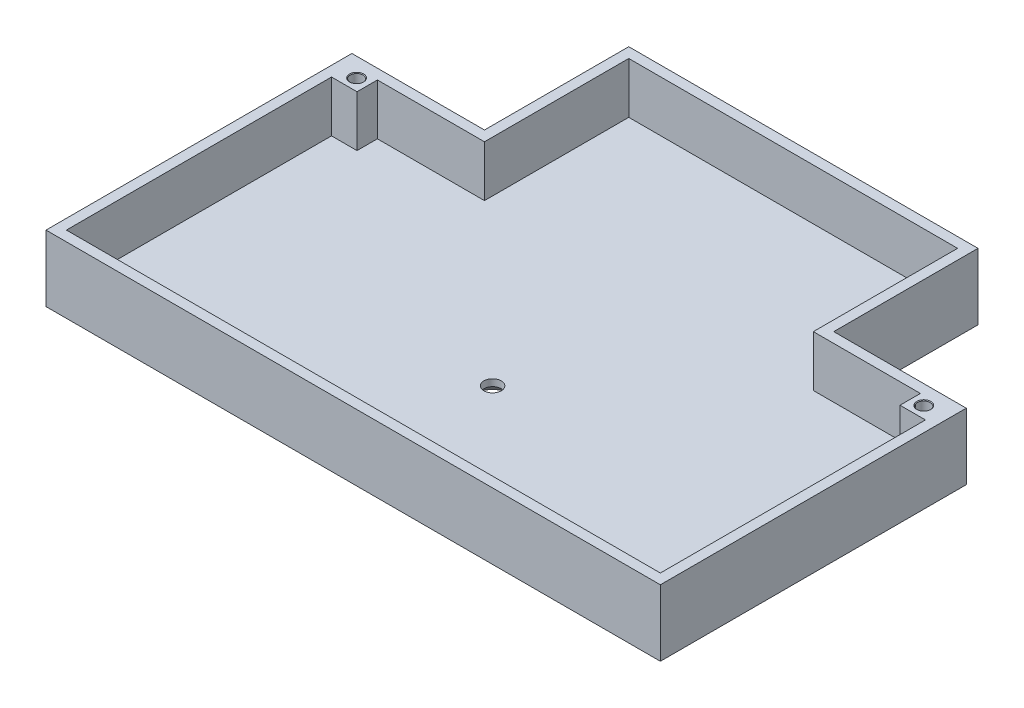
ISO-10303-21;
HEADER;
FILE_DESCRIPTION(('STEP AP214'),'2;1');
FILE_NAME('part.step','',(''),(''),'','','');
FILE_SCHEMA(('AUTOMOTIVE_DESIGN { 1 0 10303 214 1 1 1 1 }'));
ENDSEC;
DATA;
#1=APPLICATION_CONTEXT('core data for automotive mechanical design processes');
#2=APPLICATION_PROTOCOL_DEFINITION('international standard','automotive_design',2000,#1);
#3=PRODUCT_CONTEXT('',#1,'mechanical');
#4=PRODUCT('Part','Part','',(#3));
#5=PRODUCT_RELATED_PRODUCT_CATEGORY('part','',(#4));
#6=PRODUCT_DEFINITION_FORMATION('','',#4);
#7=PRODUCT_DEFINITION_CONTEXT('part definition',#1,'design');
#8=PRODUCT_DEFINITION('design','',#6,#7);
#9=PRODUCT_DEFINITION_SHAPE('','',#8);
#10=(LENGTH_UNIT() NAMED_UNIT(*) SI_UNIT(.MILLI.,.METRE.));
#11=(NAMED_UNIT(*) PLANE_ANGLE_UNIT() SI_UNIT($,.RADIAN.));
#12=(NAMED_UNIT(*) SI_UNIT($,.STERADIAN.) SOLID_ANGLE_UNIT());
#13=UNCERTAINTY_MEASURE_WITH_UNIT(LENGTH_MEASURE(1.E-05),#10,'distance_accuracy_value','');
#14=(GEOMETRIC_REPRESENTATION_CONTEXT(3) GLOBAL_UNCERTAINTY_ASSIGNED_CONTEXT((#13)) GLOBAL_UNIT_ASSIGNED_CONTEXT((#10,
#11,#12)) REPRESENTATION_CONTEXT('',''));
#15=CARTESIAN_POINT('',(0.,0.,0.));
#16=DIRECTION('',(0.,0.,1.));
#17=DIRECTION('',(1.,0.,0.));
#18=AXIS2_PLACEMENT_3D('',#15,#16,#17);
#19=CARTESIAN_POINT('',(-32.25,13.,-28.));
#20=DIRECTION('',(0.,0.,1.));
#21=DIRECTION('',(1.,0.,0.));
#22=AXIS2_PLACEMENT_3D('',#19,#20,#21);
#23=PLANE('',#22);
#24=DIRECTION('',(-1.,0.,0.));
#25=VECTOR('',#24,1.);
#26=CARTESIAN_POINT('',(-32.25,13.,-28.));
#27=LINE('',#26,#25);
#28=CARTESIAN_POINT('',(-32.25,13.,-28.));
#29=VERTEX_POINT('',#28);
#30=CARTESIAN_POINT('',(-53.25,13.,-28.));
#31=VERTEX_POINT('',#30);
#32=EDGE_CURVE('E247',#29,#31,#27,.T.);
#33=ORIENTED_EDGE('',*,*,#32,.T.);
#34=DIRECTION('',(0.,-1.,0.));
#35=VECTOR('',#34,1.);
#36=CARTESIAN_POINT('',(-53.25,13.,-28.));
#37=LINE('',#36,#35);
#38=CARTESIAN_POINT('',(-53.25,3.,-28.));
#39=VERTEX_POINT('',#38);
#40=EDGE_CURVE('E226',#31,#39,#37,.T.);
#41=ORIENTED_EDGE('',*,*,#40,.T.);
#42=DIRECTION('',(-1.,0.,0.));
#43=VECTOR('',#42,1.);
#44=CARTESIAN_POINT('',(-32.25,3.,-28.));
#45=LINE('',#44,#43);
#46=CARTESIAN_POINT('',(-32.25,3.,-28.));
#47=VERTEX_POINT('',#46);
#48=EDGE_CURVE('E266',#47,#39,#45,.T.);
#49=ORIENTED_EDGE('',*,*,#48,.F.);
#50=DIRECTION('',(0.,-1.,0.));
#51=VECTOR('',#50,1.);
#52=CARTESIAN_POINT('',(-32.25,13.,-28.));
#53=LINE('',#52,#51);
#54=EDGE_CURVE('E293',#29,#47,#53,.T.);
#55=ORIENTED_EDGE('',*,*,#54,.F.);
#56=EDGE_LOOP('',(#33,#41,#49,#55));
#57=FACE_BOUND('',#56,.T.);
#58=ADVANCED_FACE('F33',(#57),#23,.T.);
#59=CARTESIAN_POINT('',(-58.25,13.,-28.));
#60=DIRECTION('',(1.,0.,0.));
#61=DIRECTION('',(0.,0.,-1.));
#62=AXIS2_PLACEMENT_3D('',#59,#60,#61);
#63=PLANE('',#62);
#64=DIRECTION('',(0.,0.,1.));
#65=VECTOR('',#64,1.);
#66=CARTESIAN_POINT('',(-58.25,3.,-28.));
#67=LINE('',#66,#65);
#68=CARTESIAN_POINT('',(-58.25,3.,-24.));
#69=VERTEX_POINT('',#68);
#70=CARTESIAN_POINT('',(-58.25,3.,28.));
#71=VERTEX_POINT('',#70);
#72=EDGE_CURVE('E268',#69,#71,#67,.T.);
#73=ORIENTED_EDGE('',*,*,#72,.F.);
#74=DIRECTION('',(0.,-1.,0.));
#75=VECTOR('',#74,1.);
#76=CARTESIAN_POINT('',(-58.25,13.,-24.));
#77=LINE('',#76,#75);
#78=CARTESIAN_POINT('',(-58.25,13.,-24.));
#79=VERTEX_POINT('',#78);
#80=EDGE_CURVE('E236',#79,#69,#77,.T.);
#81=ORIENTED_EDGE('',*,*,#80,.F.);
#82=DIRECTION('',(0.,0.,1.));
#83=VECTOR('',#82,1.);
#84=CARTESIAN_POINT('',(-58.25,13.,-28.));
#85=LINE('',#84,#83);
#86=CARTESIAN_POINT('',(-58.25,13.,28.));
#87=VERTEX_POINT('',#86);
#88=EDGE_CURVE('E250',#79,#87,#85,.T.);
#89=ORIENTED_EDGE('',*,*,#88,.T.);
#90=DIRECTION('',(0.,-1.,0.));
#91=VECTOR('',#90,1.);
#92=CARTESIAN_POINT('',(-58.25,13.,28.));
#93=LINE('',#92,#91);
#94=EDGE_CURVE('E290',#87,#71,#93,.T.);
#95=ORIENTED_EDGE('',*,*,#94,.T.);
#96=EDGE_LOOP('',(#73,#81,#89,#95));
#97=FACE_BOUND('',#96,.T.);
#98=ADVANCED_FACE('F401',(#97),#63,.T.);
#99=CARTESIAN_POINT('',(0.,3.,0.));
#100=DIRECTION('',(0.,-1.,0.));
#101=DIRECTION('',(0.,0.,-1.));
#102=AXIS2_PLACEMENT_3D('',#99,#100,#101);
#103=PLANE('',#102);
#104=CARTESIAN_POINT('',(0.,3.,2.66000000000001));
#105=DIRECTION('',(0.,-1.,0.));
#106=DIRECTION('',(0.,0.,-1.));
#107=AXIS2_PLACEMENT_3D('',#104,#105,#106);
#108=CIRCLE('',#107,1.7);
#109=CARTESIAN_POINT('',(0.,3.,0.960000000000006));
#110=VERTEX_POINT('',#109);
#111=EDGE_CURVE('E37',#110,#110,#108,.T.);
#112=ORIENTED_EDGE('',*,*,#111,.T.);
#113=EDGE_LOOP('',(#112));
#114=FACE_BOUND('',#113,.T.);
#115=DIRECTION('',(-1.,0.,0.));
#116=VECTOR('',#115,1.);
#117=CARTESIAN_POINT('',(58.25,3.,-24.));
#118=LINE('',#117,#116);
#119=CARTESIAN_POINT('',(58.25,3.,-24.));
#120=VERTEX_POINT('',#119);
#121=CARTESIAN_POINT('',(53.25,3.,-24.));
#122=VERTEX_POINT('',#121);
#123=EDGE_CURVE('E49',#120,#122,#118,.T.);
#124=ORIENTED_EDGE('',*,*,#123,.T.);
#125=DIRECTION('',(0.,0.,-1.));
#126=VECTOR('',#125,1.);
#127=CARTESIAN_POINT('',(53.25,3.,-28.));
#128=LINE('',#127,#126);
#129=CARTESIAN_POINT('',(53.25,3.,-28.));
#130=VERTEX_POINT('',#129);
#131=EDGE_CURVE('E187',#122,#130,#128,.T.);
#132=ORIENTED_EDGE('',*,*,#131,.T.);
#133=DIRECTION('',(-1.,0.,0.));
#134=VECTOR('',#133,1.);
#135=CARTESIAN_POINT('',(58.25,3.,-28.));
#136=LINE('',#135,#134);
#137=CARTESIAN_POINT('',(32.25,3.,-28.));
#138=VERTEX_POINT('',#137);
#139=EDGE_CURVE('E275',#130,#138,#136,.T.);
#140=ORIENTED_EDGE('',*,*,#139,.T.);
#141=DIRECTION('',(0.,0.,-1.));
#142=VECTOR('',#141,1.);
#143=CARTESIAN_POINT('',(32.25,3.,-28.));
#144=LINE('',#143,#142);
#145=CARTESIAN_POINT('',(32.25,3.,-56.3));
#146=VERTEX_POINT('',#145);
#147=EDGE_CURVE('E277',#138,#146,#144,.T.);
#148=ORIENTED_EDGE('',*,*,#147,.T.);
#149=DIRECTION('',(-1.,0.,0.));
#150=VECTOR('',#149,1.);
#151=CARTESIAN_POINT('',(32.25,3.,-56.3));
#152=LINE('',#151,#150);
#153=CARTESIAN_POINT('',(-32.25,3.,-56.3));
#154=VERTEX_POINT('',#153);
#155=EDGE_CURVE('E248',#146,#154,#152,.T.);
#156=ORIENTED_EDGE('',*,*,#155,.T.);
#157=DIRECTION('',(0.,0.,1.));
#158=VECTOR('',#157,1.);
#159=CARTESIAN_POINT('',(-32.25,3.,-56.3));
#160=LINE('',#159,#158);
#161=EDGE_CURVE('E263',#154,#47,#160,.T.);
#162=ORIENTED_EDGE('',*,*,#161,.T.);
#163=ORIENTED_EDGE('',*,*,#48,.T.);
#164=DIRECTION('',(0.,0.,-1.));
#165=VECTOR('',#164,1.);
#166=CARTESIAN_POINT('',(-53.25,3.,-28.));
#167=LINE('',#166,#165);
#168=CARTESIAN_POINT('',(-53.25,3.,-24.));
#169=VERTEX_POINT('',#168);
#170=EDGE_CURVE('E223',#169,#39,#167,.T.);
#171=ORIENTED_EDGE('',*,*,#170,.F.);
#172=DIRECTION('',(1.,0.,0.));
#173=VECTOR('',#172,1.);
#174=CARTESIAN_POINT('',(-58.25,3.,-24.));
#175=LINE('',#174,#173);
#176=EDGE_CURVE('E219',#69,#169,#175,.T.);
#177=ORIENTED_EDGE('',*,*,#176,.F.);
#178=ORIENTED_EDGE('',*,*,#72,.T.);
#179=DIRECTION('',(1.,0.,0.));
#180=VECTOR('',#179,1.);
#181=CARTESIAN_POINT('',(58.25,3.,28.));
#182=LINE('',#181,#180);
#183=CARTESIAN_POINT('',(58.25,3.,28.));
#184=VERTEX_POINT('',#183);
#185=EDGE_CURVE('E270',#71,#184,#182,.T.);
#186=ORIENTED_EDGE('',*,*,#185,.T.);
#187=DIRECTION('',(0.,0.,-1.));
#188=VECTOR('',#187,1.);
#189=CARTESIAN_POINT('',(58.25,3.,-28.));
#190=LINE('',#189,#188);
#191=EDGE_CURVE('E273',#184,#120,#190,.T.);
#192=ORIENTED_EDGE('',*,*,#191,.T.);
#193=EDGE_LOOP('',(#124,#132,#140,#148,#156,#162,#163,#171,#177,#178,#186,#192));
#194=FACE_BOUND('',#193,.T.);
#195=ADVANCED_FACE('F407',(#114,#194),#103,.F.);
#196=CARTESIAN_POINT('',(60.25,3.,-30.));
#197=DIRECTION('',(0.,0.,1.));
#198=DIRECTION('',(1.,0.,0.));
#199=AXIS2_PLACEMENT_3D('',#196,#197,#198);
#200=PLANE('',#199);
#201=DIRECTION('',(0.,-1.,0.));
#202=VECTOR('',#201,1.);
#203=CARTESIAN_POINT('',(34.25,3.,-30.));
#204=LINE('',#203,#202);
#205=CARTESIAN_POINT('',(34.25,13.,-30.));
#206=VERTEX_POINT('',#205);
#207=CARTESIAN_POINT('',(34.25,0.,-30.));
#208=VERTEX_POINT('',#207);
#209=EDGE_CURVE('E329',#206,#208,#204,.T.);
#210=ORIENTED_EDGE('',*,*,#209,.F.);
#211=DIRECTION('',(-1.,0.,0.));
#212=VECTOR('',#211,1.);
#213=CARTESIAN_POINT('',(60.25,13.,-30.));
#214=LINE('',#213,#212);
#215=CARTESIAN_POINT('',(60.25,13.,-30.));
#216=VERTEX_POINT('',#215);
#217=EDGE_CURVE('E305',#216,#206,#214,.T.);
#218=ORIENTED_EDGE('',*,*,#217,.F.);
#219=DIRECTION('',(0.,-1.,0.));
#220=VECTOR('',#219,1.);
#221=CARTESIAN_POINT('',(60.25,3.,-30.));
#222=LINE('',#221,#220);
#223=CARTESIAN_POINT('',(60.25,0.,-30.));
#224=VERTEX_POINT('',#223);
#225=EDGE_CURVE('E352',#216,#224,#222,.T.);
#226=ORIENTED_EDGE('',*,*,#225,.T.);
#227=DIRECTION('',(-1.,0.,0.));
#228=VECTOR('',#227,1.);
#229=CARTESIAN_POINT('',(60.25,0.,-30.));
#230=LINE('',#229,#228);
#231=EDGE_CURVE('E346',#224,#208,#230,.T.);
#232=ORIENTED_EDGE('',*,*,#231,.T.);
#233=EDGE_LOOP('',(#210,#218,#226,#232));
#234=FACE_BOUND('',#233,.T.);
#235=ADVANCED_FACE('F368',(#234),#200,.F.);
#236=CARTESIAN_POINT('',(-60.25,3.,-30.));
#237=DIRECTION('',(1.,0.,0.));
#238=DIRECTION('',(0.,0.,-1.));
#239=AXIS2_PLACEMENT_3D('',#236,#237,#238);
#240=PLANE('',#239);
#241=DIRECTION('',(0.,0.,1.));
#242=VECTOR('',#241,1.);
#243=CARTESIAN_POINT('',(-60.25,0.,-30.));
#244=LINE('',#243,#242);
#245=CARTESIAN_POINT('',(-60.25,0.,-30.));
#246=VERTEX_POINT('',#245);
#247=CARTESIAN_POINT('',(-60.25,0.,30.));
#248=VERTEX_POINT('',#247);
#249=EDGE_CURVE('E332',#246,#248,#244,.T.);
#250=ORIENTED_EDGE('',*,*,#249,.T.);
#251=DIRECTION('',(0.,-1.,0.));
#252=VECTOR('',#251,1.);
#253=CARTESIAN_POINT('',(-60.25,3.,30.));
#254=LINE('',#253,#252);
#255=CARTESIAN_POINT('',(-60.25,13.,30.));
#256=VERTEX_POINT('',#255);
#257=EDGE_CURVE('E11',#256,#248,#254,.T.);
#258=ORIENTED_EDGE('',*,*,#257,.F.);
#259=DIRECTION('',(0.,0.,1.));
#260=VECTOR('',#259,1.);
#261=CARTESIAN_POINT('',(-60.25,13.,-30.));
#262=LINE('',#261,#260);
#263=CARTESIAN_POINT('',(-60.25,13.,-30.));
#264=VERTEX_POINT('',#263);
#265=EDGE_CURVE('E296',#264,#256,#262,.T.);
#266=ORIENTED_EDGE('',*,*,#265,.F.);
#267=DIRECTION('',(0.,-1.,0.));
#268=VECTOR('',#267,1.);
#269=CARTESIAN_POINT('',(-60.25,3.,-30.));
#270=LINE('',#269,#268);
#271=EDGE_CURVE('E349',#264,#246,#270,.T.);
#272=ORIENTED_EDGE('',*,*,#271,.T.);
#273=EDGE_LOOP('',(#250,#258,#266,#272));
#274=FACE_BOUND('',#273,.T.);
#275=ADVANCED_FACE('F35',(#274),#240,.F.);
#276=CARTESIAN_POINT('',(60.25,3.,30.));
#277=DIRECTION('',(0.,0.,-1.));
#278=DIRECTION('',(-1.,0.,0.));
#279=AXIS2_PLACEMENT_3D('',#276,#277,#278);
#280=PLANE('',#279);
#281=DIRECTION('',(1.,0.,0.));
#282=VECTOR('',#281,1.);
#283=CARTESIAN_POINT('',(60.25,0.,30.));
#284=LINE('',#283,#282);
#285=CARTESIAN_POINT('',(60.25,0.,30.));
#286=VERTEX_POINT('',#285);
#287=EDGE_CURVE('E341',#248,#286,#284,.T.);
#288=ORIENTED_EDGE('',*,*,#287,.T.);
#289=DIRECTION('',(0.,-1.,0.));
#290=VECTOR('',#289,1.);
#291=CARTESIAN_POINT('',(60.25,3.,30.));
#292=LINE('',#291,#290);
#293=CARTESIAN_POINT('',(60.25,13.,30.));
#294=VERTEX_POINT('',#293);
#295=EDGE_CURVE('E42',#294,#286,#292,.T.);
#296=ORIENTED_EDGE('',*,*,#295,.F.);
#297=DIRECTION('',(1.,0.,0.));
#298=VECTOR('',#297,1.);
#299=CARTESIAN_POINT('',(60.25,13.,30.));
#300=LINE('',#299,#298);
#301=EDGE_CURVE('E299',#256,#294,#300,.T.);
#302=ORIENTED_EDGE('',*,*,#301,.F.);
#303=ORIENTED_EDGE('',*,*,#257,.T.);
#304=EDGE_LOOP('',(#288,#296,#302,#303));
#305=FACE_BOUND('',#304,.T.);
#306=ADVANCED_FACE('F374',(#305),#280,.F.);
#307=CARTESIAN_POINT('',(60.25,3.,-30.));
#308=DIRECTION('',(-1.,0.,0.));
#309=DIRECTION('',(0.,0.,1.));
#310=AXIS2_PLACEMENT_3D('',#307,#308,#309);
#311=PLANE('',#310);
#312=DIRECTION('',(0.,0.,-1.));
#313=VECTOR('',#312,1.);
#314=CARTESIAN_POINT('',(60.25,0.,-30.));
#315=LINE('',#314,#313);
#316=EDGE_CURVE('E343',#286,#224,#315,.T.);
#317=ORIENTED_EDGE('',*,*,#316,.T.);
#318=ORIENTED_EDGE('',*,*,#225,.F.);
#319=DIRECTION('',(0.,0.,-1.));
#320=VECTOR('',#319,1.);
#321=CARTESIAN_POINT('',(60.25,13.,-30.));
#322=LINE('',#321,#320);
#323=EDGE_CURVE('E302',#294,#216,#322,.T.);
#324=ORIENTED_EDGE('',*,*,#323,.F.);
#325=ORIENTED_EDGE('',*,*,#295,.T.);
#326=EDGE_LOOP('',(#317,#318,#324,#325));
#327=FACE_BOUND('',#326,.T.);
#328=ADVANCED_FACE('F359',(#327),#311,.F.);
#329=ORIENTED_EDGE('',*,*,#271,.F.);
#330=DIRECTION('',(-1.,0.,0.));
#331=VECTOR('',#330,1.);
#332=CARTESIAN_POINT('',(-34.25,13.,-30.));
#333=LINE('',#332,#331);
#334=CARTESIAN_POINT('',(-34.25,13.,-30.));
#335=VERTEX_POINT('',#334);
#336=EDGE_CURVE('E317',#335,#264,#333,.T.);
#337=ORIENTED_EDGE('',*,*,#336,.F.);
#338=DIRECTION('',(0.,-1.,0.));
#339=VECTOR('',#338,1.);
#340=CARTESIAN_POINT('',(-34.25,3.,-30.));
#341=LINE('',#340,#339);
#342=CARTESIAN_POINT('',(-34.25,0.,-30.));
#343=VERTEX_POINT('',#342);
#344=EDGE_CURVE('E335',#335,#343,#341,.T.);
#345=ORIENTED_EDGE('',*,*,#344,.T.);
#346=EDGE_CURVE('E345',#343,#246,#230,.T.);
#347=ORIENTED_EDGE('',*,*,#346,.T.);
#348=EDGE_LOOP('',(#329,#337,#345,#347));
#349=FACE_BOUND('',#348,.T.);
#350=ADVANCED_FACE('F379',(#349),#200,.F.);
#351=CARTESIAN_POINT('',(0.,0.,0.));
#352=DIRECTION('',(0.,-1.,0.));
#353=DIRECTION('',(0.,0.,-1.));
#354=AXIS2_PLACEMENT_3D('',#351,#352,#353);
#355=PLANE('',#354);
#356=CARTESIAN_POINT('',(0.,0.,2.66000000000001));
#357=DIRECTION('',(0.,-1.,0.));
#358=DIRECTION('',(0.,0.,-1.));
#359=AXIS2_PLACEMENT_3D('',#356,#357,#358);
#360=CIRCLE('',#359,3.36);
#361=CARTESIAN_POINT('',(0.,0.,-0.699999999999994));
#362=VERTEX_POINT('',#361);
#363=EDGE_CURVE('E239',#362,#362,#360,.T.);
#364=ORIENTED_EDGE('',*,*,#363,.F.);
#365=EDGE_LOOP('',(#364));
#366=FACE_BOUND('',#365,.T.);
#367=ORIENTED_EDGE('',*,*,#249,.F.);
#368=ORIENTED_EDGE('',*,*,#346,.F.);
#369=DIRECTION('',(0.,0.,-1.));
#370=VECTOR('',#369,1.);
#371=CARTESIAN_POINT('',(-34.25,0.,-58.3));
#372=LINE('',#371,#370);
#373=CARTESIAN_POINT('',(-34.25,0.,-58.3));
#374=VERTEX_POINT('',#373);
#375=EDGE_CURVE('E323',#343,#374,#372,.T.);
#376=ORIENTED_EDGE('',*,*,#375,.T.);
#377=DIRECTION('',(1.,0.,0.));
#378=VECTOR('',#377,1.);
#379=CARTESIAN_POINT('',(34.25,0.,-58.3));
#380=LINE('',#379,#378);
#381=CARTESIAN_POINT('',(34.25,0.,-58.3));
#382=VERTEX_POINT('',#381);
#383=EDGE_CURVE('E326',#374,#382,#380,.T.);
#384=ORIENTED_EDGE('',*,*,#383,.T.);
#385=DIRECTION('',(0.,0.,1.));
#386=VECTOR('',#385,1.);
#387=CARTESIAN_POINT('',(34.25,0.,-30.));
#388=LINE('',#387,#386);
#389=EDGE_CURVE('E320',#382,#208,#388,.T.);
#390=ORIENTED_EDGE('',*,*,#389,.T.);
#391=ORIENTED_EDGE('',*,*,#231,.F.);
#392=ORIENTED_EDGE('',*,*,#316,.F.);
#393=ORIENTED_EDGE('',*,*,#287,.F.);
#394=EDGE_LOOP('',(#367,#368,#376,#384,#390,#391,#392,#393));
#395=FACE_BOUND('',#394,.T.);
#396=ADVANCED_FACE('F365',(#366,#395),#355,.T.);
#397=CARTESIAN_POINT('',(34.25,3.,-30.));
#398=DIRECTION('',(1.,0.,0.));
#399=DIRECTION('',(0.,0.,-1.));
#400=AXIS2_PLACEMENT_3D('',#397,#398,#399);
#401=PLANE('',#400);
#402=ORIENTED_EDGE('',*,*,#389,.F.);
#403=DIRECTION('',(0.,-1.,0.));
#404=VECTOR('',#403,1.);
#405=CARTESIAN_POINT('',(34.25,3.,-58.3));
#406=LINE('',#405,#404);
#407=CARTESIAN_POINT('',(34.25,13.,-58.3));
#408=VERTEX_POINT('',#407);
#409=EDGE_CURVE('E330',#408,#382,#406,.T.);
#410=ORIENTED_EDGE('',*,*,#409,.F.);
#411=DIRECTION('',(0.,0.,-1.));
#412=VECTOR('',#411,1.);
#413=CARTESIAN_POINT('',(34.25,13.,-30.));
#414=LINE('',#413,#412);
#415=EDGE_CURVE('E308',#206,#408,#414,.T.);
#416=ORIENTED_EDGE('',*,*,#415,.F.);
#417=ORIENTED_EDGE('',*,*,#209,.T.);
#418=EDGE_LOOP('',(#402,#410,#416,#417));
#419=FACE_BOUND('',#418,.T.);
#420=ADVANCED_FACE('F388',(#419),#401,.T.);
#421=CARTESIAN_POINT('',(34.25,3.,-58.3));
#422=DIRECTION('',(0.,0.,-1.));
#423=DIRECTION('',(-1.,0.,0.));
#424=AXIS2_PLACEMENT_3D('',#421,#422,#423);
#425=PLANE('',#424);
#426=ORIENTED_EDGE('',*,*,#383,.F.);
#427=DIRECTION('',(0.,-1.,0.));
#428=VECTOR('',#427,1.);
#429=CARTESIAN_POINT('',(-34.25,3.,-58.3));
#430=LINE('',#429,#428);
#431=CARTESIAN_POINT('',(-34.25,13.,-58.3));
#432=VERTEX_POINT('',#431);
#433=EDGE_CURVE('E333',#432,#374,#430,.T.);
#434=ORIENTED_EDGE('',*,*,#433,.F.);
#435=DIRECTION('',(-1.,0.,0.));
#436=VECTOR('',#435,1.);
#437=CARTESIAN_POINT('',(34.25,13.,-58.3));
#438=LINE('',#437,#436);
#439=EDGE_CURVE('E311',#408,#432,#438,.T.);
#440=ORIENTED_EDGE('',*,*,#439,.F.);
#441=ORIENTED_EDGE('',*,*,#409,.T.);
#442=EDGE_LOOP('',(#426,#434,#440,#441));
#443=FACE_BOUND('',#442,.T.);
#444=ADVANCED_FACE('F386',(#443),#425,.T.);
#445=CARTESIAN_POINT('',(-34.25,3.,-58.3));
#446=DIRECTION('',(-1.,0.,0.));
#447=DIRECTION('',(0.,0.,1.));
#448=AXIS2_PLACEMENT_3D('',#445,#446,#447);
#449=PLANE('',#448);
#450=ORIENTED_EDGE('',*,*,#375,.F.);
#451=ORIENTED_EDGE('',*,*,#344,.F.);
#452=DIRECTION('',(0.,0.,1.));
#453=VECTOR('',#452,1.);
#454=CARTESIAN_POINT('',(-34.25,13.,-58.3));
#455=LINE('',#454,#453);
#456=EDGE_CURVE('E314',#432,#335,#455,.T.);
#457=ORIENTED_EDGE('',*,*,#456,.F.);
#458=ORIENTED_EDGE('',*,*,#433,.T.);
#459=EDGE_LOOP('',(#450,#451,#457,#458));
#460=FACE_BOUND('',#459,.T.);
#461=ADVANCED_FACE('F383',(#460),#449,.T.);
#462=CARTESIAN_POINT('',(0.,13.,0.));
#463=DIRECTION('',(0.,-1.,0.));
#464=DIRECTION('',(0.,0.,-1.));
#465=AXIS2_PLACEMENT_3D('',#462,#463,#464);
#466=PLANE('',#465);
#467=CARTESIAN_POINT('',(55.626,13.,-26.296));
#468=DIRECTION('',(0.,1.,0.));
#469=DIRECTION('',(0.,0.,1.));
#470=AXIS2_PLACEMENT_3D('',#467,#468,#469);
#471=CIRCLE('',#470,1.375);
#472=CARTESIAN_POINT('',(55.626,13.,-24.921));
#473=VERTEX_POINT('',#472);
#474=EDGE_CURVE('E192',#473,#473,#471,.T.);
#475=ORIENTED_EDGE('',*,*,#474,.F.);
#476=EDGE_LOOP('',(#475));
#477=FACE_BOUND('',#476,.T.);
#478=DIRECTION('',(-1.,0.,0.));
#479=VECTOR('',#478,1.);
#480=CARTESIAN_POINT('',(58.25,13.,-24.));
#481=LINE('',#480,#479);
#482=CARTESIAN_POINT('',(58.25,13.,-24.));
#483=VERTEX_POINT('',#482);
#484=CARTESIAN_POINT('',(53.25,13.,-24.));
#485=VERTEX_POINT('',#484);
#486=EDGE_CURVE('E199',#483,#485,#481,.T.);
#487=ORIENTED_EDGE('',*,*,#486,.F.);
#488=DIRECTION('',(0.,0.,-1.));
#489=VECTOR('',#488,1.);
#490=CARTESIAN_POINT('',(58.25,13.,-28.));
#491=LINE('',#490,#489);
#492=CARTESIAN_POINT('',(58.25,13.,28.));
#493=VERTEX_POINT('',#492);
#494=EDGE_CURVE('E57',#493,#483,#491,.T.);
#495=ORIENTED_EDGE('',*,*,#494,.F.);
#496=DIRECTION('',(1.,0.,0.));
#497=VECTOR('',#496,1.);
#498=CARTESIAN_POINT('',(58.25,13.,28.));
#499=LINE('',#498,#497);
#500=EDGE_CURVE('E252',#87,#493,#499,.T.);
#501=ORIENTED_EDGE('',*,*,#500,.F.);
#502=ORIENTED_EDGE('',*,*,#88,.F.);
#503=DIRECTION('',(1.,0.,0.));
#504=VECTOR('',#503,1.);
#505=CARTESIAN_POINT('',(-58.25,13.,-24.));
#506=LINE('',#505,#504);
#507=CARTESIAN_POINT('',(-53.25,13.,-24.));
#508=VERTEX_POINT('',#507);
#509=EDGE_CURVE('E220',#79,#508,#506,.T.);
#510=ORIENTED_EDGE('',*,*,#509,.T.);
#511=DIRECTION('',(0.,0.,-1.));
#512=VECTOR('',#511,1.);
#513=CARTESIAN_POINT('',(-53.25,13.,-28.));
#514=LINE('',#513,#512);
#515=EDGE_CURVE('E222',#508,#31,#514,.T.);
#516=ORIENTED_EDGE('',*,*,#515,.T.);
#517=ORIENTED_EDGE('',*,*,#32,.F.);
#518=DIRECTION('',(0.,0.,1.));
#519=VECTOR('',#518,1.);
#520=CARTESIAN_POINT('',(-32.25,13.,-56.3));
#521=LINE('',#520,#519);
#522=CARTESIAN_POINT('',(-32.25,13.,-56.3));
#523=VERTEX_POINT('',#522);
#524=EDGE_CURVE('E245',#523,#29,#521,.T.);
#525=ORIENTED_EDGE('',*,*,#524,.F.);
#526=DIRECTION('',(-1.,0.,0.));
#527=VECTOR('',#526,1.);
#528=CARTESIAN_POINT('',(32.25,13.,-56.3));
#529=LINE('',#528,#527);
#530=CARTESIAN_POINT('',(32.25,13.,-56.3));
#531=VERTEX_POINT('',#530);
#532=EDGE_CURVE('E260',#531,#523,#529,.T.);
#533=ORIENTED_EDGE('',*,*,#532,.F.);
#534=DIRECTION('',(0.,0.,-1.));
#535=VECTOR('',#534,1.);
#536=CARTESIAN_POINT('',(32.25,13.,-28.));
#537=LINE('',#536,#535);
#538=CARTESIAN_POINT('',(32.25,13.,-28.));
#539=VERTEX_POINT('',#538);
#540=EDGE_CURVE('E257',#539,#531,#537,.T.);
#541=ORIENTED_EDGE('',*,*,#540,.F.);
#542=DIRECTION('',(-1.,0.,0.));
#543=VECTOR('',#542,1.);
#544=CARTESIAN_POINT('',(58.25,13.,-28.));
#545=LINE('',#544,#543);
#546=CARTESIAN_POINT('',(53.25,13.,-28.));
#547=VERTEX_POINT('',#546);
#548=EDGE_CURVE('E255',#547,#539,#545,.T.);
#549=ORIENTED_EDGE('',*,*,#548,.F.);
#550=DIRECTION('',(0.,0.,-1.));
#551=VECTOR('',#550,1.);
#552=CARTESIAN_POINT('',(53.25,13.,-28.));
#553=LINE('',#552,#551);
#554=EDGE_CURVE('E196',#485,#547,#553,.T.);
#555=ORIENTED_EDGE('',*,*,#554,.F.);
#556=EDGE_LOOP('',(#487,#495,#501,#502,#510,#516,#517,#525,#533,#541,#549,#555));
#557=FACE_BOUND('',#556,.T.);
#558=CARTESIAN_POINT('',(-55.626,13.,-26.296));
#559=DIRECTION('',(0.,1.,0.));
#560=DIRECTION('',(0.,0.,1.));
#561=AXIS2_PLACEMENT_3D('',#558,#559,#560);
#562=CIRCLE('',#561,1.375);
#563=CARTESIAN_POINT('',(-55.626,13.,-24.921));
#564=VERTEX_POINT('',#563);
#565=EDGE_CURVE('E210',#564,#564,#562,.T.);
#566=ORIENTED_EDGE('',*,*,#565,.F.);
#567=EDGE_LOOP('',(#566));
#568=FACE_BOUND('',#567,.T.);
#569=ORIENTED_EDGE('',*,*,#265,.T.);
#570=ORIENTED_EDGE('',*,*,#301,.T.);
#571=ORIENTED_EDGE('',*,*,#323,.T.);
#572=ORIENTED_EDGE('',*,*,#217,.T.);
#573=ORIENTED_EDGE('',*,*,#415,.T.);
#574=ORIENTED_EDGE('',*,*,#439,.T.);
#575=ORIENTED_EDGE('',*,*,#456,.T.);
#576=ORIENTED_EDGE('',*,*,#336,.T.);
#577=EDGE_LOOP('',(#569,#570,#571,#572,#573,#574,#575,#576));
#578=FACE_BOUND('',#577,.T.);
#579=ADVANCED_FACE('F371',(#477,#557,#568,#578),#466,.F.);
#580=CARTESIAN_POINT('',(-32.25,13.,-56.3));
#581=DIRECTION('',(1.,0.,0.));
#582=DIRECTION('',(0.,0.,-1.));
#583=AXIS2_PLACEMENT_3D('',#580,#581,#582);
#584=PLANE('',#583);
#585=ORIENTED_EDGE('',*,*,#161,.F.);
#586=DIRECTION('',(0.,-1.,0.));
#587=VECTOR('',#586,1.);
#588=CARTESIAN_POINT('',(-32.25,13.,-56.3));
#589=LINE('',#588,#587);
#590=EDGE_CURVE('E262',#523,#154,#589,.T.);
#591=ORIENTED_EDGE('',*,*,#590,.F.);
#592=ORIENTED_EDGE('',*,*,#524,.T.);
#593=ORIENTED_EDGE('',*,*,#54,.T.);
#594=EDGE_LOOP('',(#585,#591,#592,#593));
#595=FACE_BOUND('',#594,.T.);
#596=ADVANCED_FACE('F412',(#595),#584,.T.);
#597=CARTESIAN_POINT('',(58.25,13.,28.));
#598=DIRECTION('',(0.,0.,-1.));
#599=DIRECTION('',(-1.,0.,0.));
#600=AXIS2_PLACEMENT_3D('',#597,#598,#599);
#601=PLANE('',#600);
#602=ORIENTED_EDGE('',*,*,#185,.F.);
#603=ORIENTED_EDGE('',*,*,#94,.F.);
#604=ORIENTED_EDGE('',*,*,#500,.T.);
#605=DIRECTION('',(0.,-1.,0.));
#606=VECTOR('',#605,1.);
#607=CARTESIAN_POINT('',(58.25,13.,28.));
#608=LINE('',#607,#606);
#609=EDGE_CURVE('E288',#493,#184,#608,.T.);
#610=ORIENTED_EDGE('',*,*,#609,.T.);
#611=EDGE_LOOP('',(#602,#603,#604,#610));
#612=FACE_BOUND('',#611,.T.);
#613=ADVANCED_FACE('F415',(#612),#601,.T.);
#614=CARTESIAN_POINT('',(58.25,13.,-28.));
#615=DIRECTION('',(-1.,0.,0.));
#616=DIRECTION('',(0.,0.,1.));
#617=AXIS2_PLACEMENT_3D('',#614,#615,#616);
#618=PLANE('',#617);
#619=DIRECTION('',(0.,-1.,0.));
#620=VECTOR('',#619,1.);
#621=CARTESIAN_POINT('',(58.25,13.,-24.));
#622=LINE('',#621,#620);
#623=EDGE_CURVE('E201',#483,#120,#622,.T.);
#624=ORIENTED_EDGE('',*,*,#623,.T.);
#625=ORIENTED_EDGE('',*,*,#191,.F.);
#626=ORIENTED_EDGE('',*,*,#609,.F.);
#627=ORIENTED_EDGE('',*,*,#494,.T.);
#628=EDGE_LOOP('',(#624,#625,#626,#627));
#629=FACE_BOUND('',#628,.T.);
#630=ADVANCED_FACE('F440',(#629),#618,.T.);
#631=CARTESIAN_POINT('',(58.25,13.,-28.));
#632=DIRECTION('',(0.,0.,1.));
#633=DIRECTION('',(1.,0.,0.));
#634=AXIS2_PLACEMENT_3D('',#631,#632,#633);
#635=PLANE('',#634);
#636=DIRECTION('',(0.,-1.,0.));
#637=VECTOR('',#636,1.);
#638=CARTESIAN_POINT('',(53.25,13.,-28.));
#639=LINE('',#638,#637);
#640=EDGE_CURVE('E207',#547,#130,#639,.T.);
#641=ORIENTED_EDGE('',*,*,#640,.F.);
#642=ORIENTED_EDGE('',*,*,#548,.T.);
#643=DIRECTION('',(0.,-1.,0.));
#644=VECTOR('',#643,1.);
#645=CARTESIAN_POINT('',(32.25,13.,-28.));
#646=LINE('',#645,#644);
#647=EDGE_CURVE('E285',#539,#138,#646,.T.);
#648=ORIENTED_EDGE('',*,*,#647,.T.);
#649=ORIENTED_EDGE('',*,*,#139,.F.);
#650=EDGE_LOOP('',(#641,#642,#648,#649));
#651=FACE_BOUND('',#650,.T.);
#652=ADVANCED_FACE('F447',(#651),#635,.T.);
#653=CARTESIAN_POINT('',(32.25,13.,-28.));
#654=DIRECTION('',(-1.,0.,0.));
#655=DIRECTION('',(0.,0.,1.));
#656=AXIS2_PLACEMENT_3D('',#653,#654,#655);
#657=PLANE('',#656);
#658=ORIENTED_EDGE('',*,*,#147,.F.);
#659=ORIENTED_EDGE('',*,*,#647,.F.);
#660=ORIENTED_EDGE('',*,*,#540,.T.);
#661=DIRECTION('',(0.,-1.,0.));
#662=VECTOR('',#661,1.);
#663=CARTESIAN_POINT('',(32.25,13.,-56.3));
#664=LINE('',#663,#662);
#665=EDGE_CURVE('E283',#531,#146,#664,.T.);
#666=ORIENTED_EDGE('',*,*,#665,.T.);
#667=EDGE_LOOP('',(#658,#659,#660,#666));
#668=FACE_BOUND('',#667,.T.);
#669=ADVANCED_FACE('F454',(#668),#657,.T.);
#670=CARTESIAN_POINT('',(32.25,13.,-56.3));
#671=DIRECTION('',(0.,0.,1.));
#672=DIRECTION('',(1.,0.,0.));
#673=AXIS2_PLACEMENT_3D('',#670,#671,#672);
#674=PLANE('',#673);
#675=ORIENTED_EDGE('',*,*,#155,.F.);
#676=ORIENTED_EDGE('',*,*,#665,.F.);
#677=ORIENTED_EDGE('',*,*,#532,.T.);
#678=ORIENTED_EDGE('',*,*,#590,.T.);
#679=EDGE_LOOP('',(#675,#676,#677,#678));
#680=FACE_BOUND('',#679,.T.);
#681=ADVANCED_FACE('F462',(#680),#674,.T.);
#682=CARTESIAN_POINT('',(0.,0.,2.66000000000001));
#683=DIRECTION('',(0.,-1.,0.));
#684=DIRECTION('',(0.,0.,-1.));
#685=AXIS2_PLACEMENT_3D('',#682,#683,#684);
#686=CYLINDRICAL_SURFACE('',#685,1.7);
#687=CARTESIAN_POINT('',(0.,1.66,2.66000000000001));
#688=DIRECTION('',(0.,-1.,0.));
#689=DIRECTION('',(0.,0.,-1.));
#690=AXIS2_PLACEMENT_3D('',#687,#688,#689);
#691=CIRCLE('',#690,1.7);
#692=CARTESIAN_POINT('',(0.,1.66,0.960000000000006));
#693=VERTEX_POINT('',#692);
#694=EDGE_CURVE('E242',#693,#693,#691,.T.);
#695=ORIENTED_EDGE('',*,*,#694,.T.);
#696=EDGE_LOOP('',(#695));
#697=FACE_BOUND('',#696,.T.);
#698=ORIENTED_EDGE('',*,*,#111,.F.);
#699=EDGE_LOOP('',(#698));
#700=FACE_BOUND('',#699,.T.);
#701=ADVANCED_FACE('F470',(#697,#700),#686,.F.);
#702=CARTESIAN_POINT('',(0.,0.,2.66000000000001));
#703=DIRECTION('',(0.,-1.,0.));
#704=DIRECTION('',(0.,0.,-1.));
#705=AXIS2_PLACEMENT_3D('',#702,#703,#704);
#706=CONICAL_SURFACE('',#705,3.36,0.785398163397448);
#707=ORIENTED_EDGE('',*,*,#694,.F.);
#708=EDGE_LOOP('',(#707));
#709=FACE_BOUND('',#708,.T.);
#710=ORIENTED_EDGE('',*,*,#363,.T.);
#711=EDGE_LOOP('',(#710));
#712=FACE_BOUND('',#711,.T.);
#713=ADVANCED_FACE('F479',(#709,#712),#706,.F.);
#714=CARTESIAN_POINT('',(-58.25,13.,-24.));
#715=DIRECTION('',(0.,0.,-1.));
#716=DIRECTION('',(-1.,0.,0.));
#717=AXIS2_PLACEMENT_3D('',#714,#715,#716);
#718=PLANE('',#717);
#719=ORIENTED_EDGE('',*,*,#176,.T.);
#720=DIRECTION('',(0.,-1.,0.));
#721=VECTOR('',#720,1.);
#722=CARTESIAN_POINT('',(-53.25,13.,-24.));
#723=LINE('',#722,#721);
#724=EDGE_CURVE('E233',#508,#169,#723,.T.);
#725=ORIENTED_EDGE('',*,*,#724,.F.);
#726=ORIENTED_EDGE('',*,*,#509,.F.);
#727=ORIENTED_EDGE('',*,*,#80,.T.);
#728=EDGE_LOOP('',(#719,#725,#726,#727));
#729=FACE_BOUND('',#728,.T.);
#730=ADVANCED_FACE('F487',(#729),#718,.F.);
#731=CARTESIAN_POINT('',(-53.25,13.,-28.));
#732=DIRECTION('',(-1.,0.,0.));
#733=DIRECTION('',(0.,0.,1.));
#734=AXIS2_PLACEMENT_3D('',#731,#732,#733);
#735=PLANE('',#734);
#736=ORIENTED_EDGE('',*,*,#170,.T.);
#737=ORIENTED_EDGE('',*,*,#40,.F.);
#738=ORIENTED_EDGE('',*,*,#515,.F.);
#739=ORIENTED_EDGE('',*,*,#724,.T.);
#740=EDGE_LOOP('',(#736,#737,#738,#739));
#741=FACE_BOUND('',#740,.T.);
#742=ADVANCED_FACE('F495',(#741),#735,.F.);
#743=CARTESIAN_POINT('',(-55.626,5.,-26.296));
#744=DIRECTION('',(0.,1.,0.));
#745=DIRECTION('',(0.,0.,1.));
#746=AXIS2_PLACEMENT_3D('',#743,#744,#745);
#747=CONICAL_SURFACE('',#746,1.25,1.02974425867666);
#748=CARTESIAN_POINT('',(-55.626,4.24892422621555,-26.296));
#749=VERTEX_POINT('',#748);
#750=VERTEX_LOOP('',#749);
#751=FACE_BOUND('',#750,.T.);
#752=CARTESIAN_POINT('',(-55.626,5.,-26.296));
#753=DIRECTION('',(0.,1.,0.));
#754=DIRECTION('',(0.,0.,1.));
#755=AXIS2_PLACEMENT_3D('',#752,#753,#754);
#756=CIRCLE('',#755,1.25);
#757=CARTESIAN_POINT('',(-55.626,5.,-25.046));
#758=VERTEX_POINT('',#757);
#759=EDGE_CURVE('E216',#758,#758,#756,.T.);
#760=ORIENTED_EDGE('',*,*,#759,.T.);
#761=EDGE_LOOP('',(#760));
#762=FACE_BOUND('',#761,.T.);
#763=ADVANCED_FACE('F504',(#751,#762),#747,.F.);
#764=CARTESIAN_POINT('',(-55.626,13.,-26.296));
#765=DIRECTION('',(0.,1.,0.));
#766=DIRECTION('',(0.,0.,1.));
#767=AXIS2_PLACEMENT_3D('',#764,#765,#766);
#768=CYLINDRICAL_SURFACE('',#767,1.25);
#769=ORIENTED_EDGE('',*,*,#759,.F.);
#770=EDGE_LOOP('',(#769));
#771=FACE_BOUND('',#770,.T.);
#772=CARTESIAN_POINT('',(-55.626,12.875,-26.296));
#773=DIRECTION('',(0.,1.,0.));
#774=DIRECTION('',(0.,0.,1.));
#775=AXIS2_PLACEMENT_3D('',#772,#773,#774);
#776=CIRCLE('',#775,1.25);
#777=CARTESIAN_POINT('',(-55.626,12.875,-25.046));
#778=VERTEX_POINT('',#777);
#779=EDGE_CURVE('E213',#778,#778,#776,.T.);
#780=ORIENTED_EDGE('',*,*,#779,.T.);
#781=EDGE_LOOP('',(#780));
#782=FACE_BOUND('',#781,.T.);
#783=ADVANCED_FACE('F512',(#771,#782),#768,.F.);
#784=CARTESIAN_POINT('',(-55.626,13.,-26.296));
#785=DIRECTION('',(0.,1.,0.));
#786=DIRECTION('',(0.,0.,1.));
#787=AXIS2_PLACEMENT_3D('',#784,#785,#786);
#788=CONICAL_SURFACE('',#787,1.375,0.785398163397448);
#789=ORIENTED_EDGE('',*,*,#779,.F.);
#790=EDGE_LOOP('',(#789));
#791=FACE_BOUND('',#790,.T.);
#792=ORIENTED_EDGE('',*,*,#565,.T.);
#793=EDGE_LOOP('',(#792));
#794=FACE_BOUND('',#793,.T.);
#795=ADVANCED_FACE('F520',(#791,#794),#788,.F.);
#796=CARTESIAN_POINT('',(53.25,13.,-28.));
#797=DIRECTION('',(-1.,0.,0.));
#798=DIRECTION('',(0.,0.,1.));
#799=AXIS2_PLACEMENT_3D('',#796,#797,#798);
#800=PLANE('',#799);
#801=ORIENTED_EDGE('',*,*,#131,.F.);
#802=DIRECTION('',(0.,-1.,0.));
#803=VECTOR('',#802,1.);
#804=CARTESIAN_POINT('',(53.25,13.,-24.));
#805=LINE('',#804,#803);
#806=EDGE_CURVE('E205',#485,#122,#805,.T.);
#807=ORIENTED_EDGE('',*,*,#806,.F.);
#808=ORIENTED_EDGE('',*,*,#554,.T.);
#809=ORIENTED_EDGE('',*,*,#640,.T.);
#810=EDGE_LOOP('',(#801,#807,#808,#809));
#811=FACE_BOUND('',#810,.T.);
#812=ADVANCED_FACE('F528',(#811),#800,.T.);
#813=CARTESIAN_POINT('',(58.25,13.,-24.));
#814=DIRECTION('',(0.,0.,1.));
#815=DIRECTION('',(1.,0.,0.));
#816=AXIS2_PLACEMENT_3D('',#813,#814,#815);
#817=PLANE('',#816);
#818=ORIENTED_EDGE('',*,*,#123,.F.);
#819=ORIENTED_EDGE('',*,*,#623,.F.);
#820=ORIENTED_EDGE('',*,*,#486,.T.);
#821=ORIENTED_EDGE('',*,*,#806,.T.);
#822=EDGE_LOOP('',(#818,#819,#820,#821));
#823=FACE_BOUND('',#822,.T.);
#824=ADVANCED_FACE('F181',(#823),#817,.T.);
#825=CARTESIAN_POINT('',(55.626,5.,-26.296));
#826=DIRECTION('',(0.,1.,0.));
#827=DIRECTION('',(0.,0.,1.));
#828=AXIS2_PLACEMENT_3D('',#825,#826,#827);
#829=CONICAL_SURFACE('',#828,1.25,1.02974425867666);
#830=CARTESIAN_POINT('',(55.626,4.24892422621555,-26.296));
#831=VERTEX_POINT('',#830);
#832=VERTEX_LOOP('',#831);
#833=FACE_BOUND('',#832,.T.);
#834=CARTESIAN_POINT('',(55.626,5.,-26.296));
#835=DIRECTION('',(0.,1.,0.));
#836=DIRECTION('',(0.,0.,1.));
#837=AXIS2_PLACEMENT_3D('',#834,#835,#836);
#838=CIRCLE('',#837,1.25);
#839=CARTESIAN_POINT('',(55.626,5.,-25.046));
#840=VERTEX_POINT('',#839);
#841=EDGE_CURVE('E185',#840,#840,#838,.T.);
#842=ORIENTED_EDGE('',*,*,#841,.T.);
#843=EDGE_LOOP('',(#842));
#844=FACE_BOUND('',#843,.T.);
#845=ADVANCED_FACE('F177',(#833,#844),#829,.F.);
#846=CARTESIAN_POINT('',(55.626,13.,-26.296));
#847=DIRECTION('',(0.,1.,0.));
#848=DIRECTION('',(0.,0.,1.));
#849=AXIS2_PLACEMENT_3D('',#846,#847,#848);
#850=CYLINDRICAL_SURFACE('',#849,1.25);
#851=ORIENTED_EDGE('',*,*,#841,.F.);
#852=EDGE_LOOP('',(#851));
#853=FACE_BOUND('',#852,.T.);
#854=CARTESIAN_POINT('',(55.626,12.875,-26.296));
#855=DIRECTION('',(0.,1.,0.));
#856=DIRECTION('',(0.,0.,1.));
#857=AXIS2_PLACEMENT_3D('',#854,#855,#856);
#858=CIRCLE('',#857,1.25);
#859=CARTESIAN_POINT('',(55.626,12.875,-25.046));
#860=VERTEX_POINT('',#859);
#861=EDGE_CURVE('E188',#860,#860,#858,.T.);
#862=ORIENTED_EDGE('',*,*,#861,.T.);
#863=EDGE_LOOP('',(#862));
#864=FACE_BOUND('',#863,.T.);
#865=ADVANCED_FACE('F180',(#853,#864),#850,.F.);
#866=CARTESIAN_POINT('',(55.626,13.,-26.296));
#867=DIRECTION('',(0.,1.,0.));
#868=DIRECTION('',(0.,0.,1.));
#869=AXIS2_PLACEMENT_3D('',#866,#867,#868);
#870=CONICAL_SURFACE('',#869,1.375,0.785398163397448);
#871=ORIENTED_EDGE('',*,*,#861,.F.);
#872=EDGE_LOOP('',(#871));
#873=FACE_BOUND('',#872,.T.);
#874=ORIENTED_EDGE('',*,*,#474,.T.);
#875=EDGE_LOOP('',(#874));
#876=FACE_BOUND('',#875,.T.);
#877=ADVANCED_FACE('F553',(#873,#876),#870,.F.);
#878=CLOSED_SHELL('',(#58,#98,#195,#235,#275,#306,#328,#350,#396,#420,#444,#461,#579,#596,#613,
#630,#652,#669,#681,#701,#713,#730,#742,#763,#783,#795,#812,#824,#845,#865,#877));
#879=MANIFOLD_SOLID_BREP('B2',#878);
#880=ADVANCED_BREP_SHAPE_REPRESENTATION('',(#18,#879),#14);
#881=SHAPE_DEFINITION_REPRESENTATION(#9,#880);
ENDSEC;
END-ISO-10303-21;
